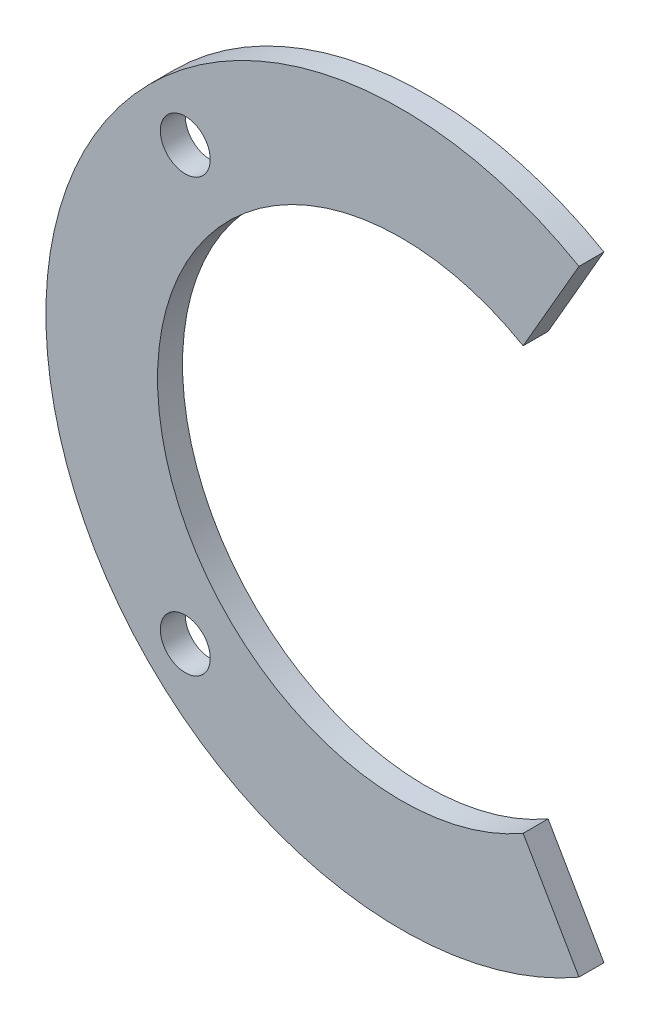
ISO-10303-21;
HEADER;
FILE_DESCRIPTION(('STEP AP214'),'2;1');
FILE_NAME('part.step','',(''),(''),'','','');
FILE_SCHEMA(('AUTOMOTIVE_DESIGN { 1 0 10303 214 1 1 1 1 }'));
ENDSEC;
DATA;
#1=APPLICATION_CONTEXT('core data for automotive mechanical design processes');
#2=APPLICATION_PROTOCOL_DEFINITION('international standard','automotive_design',2000,#1);
#3=PRODUCT_CONTEXT('',#1,'mechanical');
#4=PRODUCT('Part','Part','',(#3));
#5=PRODUCT_RELATED_PRODUCT_CATEGORY('part','',(#4));
#6=PRODUCT_DEFINITION_FORMATION('','',#4);
#7=PRODUCT_DEFINITION_CONTEXT('part definition',#1,'design');
#8=PRODUCT_DEFINITION('design','',#6,#7);
#9=PRODUCT_DEFINITION_SHAPE('','',#8);
#10=(LENGTH_UNIT() NAMED_UNIT(*) SI_UNIT(.MILLI.,.METRE.));
#11=(NAMED_UNIT(*) PLANE_ANGLE_UNIT() SI_UNIT($,.RADIAN.));
#12=(NAMED_UNIT(*) SI_UNIT($,.STERADIAN.) SOLID_ANGLE_UNIT());
#13=UNCERTAINTY_MEASURE_WITH_UNIT(LENGTH_MEASURE(1.E-05),#10,'distance_accuracy_value','');
#14=(GEOMETRIC_REPRESENTATION_CONTEXT(3) GLOBAL_UNCERTAINTY_ASSIGNED_CONTEXT((#13)) GLOBAL_UNIT_ASSIGNED_CONTEXT((#10,
#11,#12)) REPRESENTATION_CONTEXT('',''));
#15=CARTESIAN_POINT('',(0.,0.,0.));
#16=DIRECTION('',(0.,0.,1.));
#17=DIRECTION('',(1.,0.,0.));
#18=AXIS2_PLACEMENT_3D('',#15,#16,#17);
#19=CARTESIAN_POINT('',(0.,0.,3.175));
#20=DIRECTION('',(0.,0.,1.));
#21=DIRECTION('',(1.,0.,0.));
#22=AXIS2_PLACEMENT_3D('',#19,#20,#21);
#23=PLANE('',#22);
#24=CARTESIAN_POINT('',(-27.4710984490973,-27.4710984490974,3.175));
#25=DIRECTION('',(0.,0.,1.));
#26=DIRECTION('',(1.,0.,0.));
#27=AXIS2_PLACEMENT_3D('',#24,#25,#26);
#28=CIRCLE('',#27,3.175);
#29=CARTESIAN_POINT('',(-24.2960984490973,-27.4710984490974,3.175));
#30=VERTEX_POINT('',#29);
#31=EDGE_CURVE('E112',#30,#30,#28,.T.);
#32=ORIENTED_EDGE('',*,*,#31,.F.);
#33=EDGE_LOOP('',(#32));
#34=FACE_BOUND('',#33,.T.);
#35=CARTESIAN_POINT('',(0.,0.,3.175));
#36=DIRECTION('',(0.,0.,-1.));
#37=DIRECTION('',(1.,0.,0.));
#38=AXIS2_PLACEMENT_3D('',#35,#36,#37);
#39=CIRCLE('',#38,31.000000024);
#40=CARTESIAN_POINT('',(15.5000000119999,-26.8467875381022,3.175));
#41=VERTEX_POINT('',#40);
#42=CARTESIAN_POINT('',(15.5000000119999,26.8467875381022,3.175));
#43=VERTEX_POINT('',#42);
#44=EDGE_CURVE('E92',#41,#43,#39,.T.);
#45=ORIENTED_EDGE('',*,*,#44,.T.);
#46=DIRECTION('',(0.499999999999998,0.866025403784439,0.));
#47=VECTOR('',#46,1.);
#48=CARTESIAN_POINT('',(22.5999999999999,39.1443482510567,3.175));
#49=LINE('',#48,#47);
#50=CARTESIAN_POINT('',(22.5999999999999,39.1443482510567,3.175));
#51=VERTEX_POINT('',#50);
#52=EDGE_CURVE('E87',#43,#51,#49,.T.);
#53=ORIENTED_EDGE('',*,*,#52,.T.);
#54=CARTESIAN_POINT('',(0.,0.,3.175));
#55=DIRECTION('',(0.,0.,1.));
#56=DIRECTION('',(1.,0.,0.));
#57=AXIS2_PLACEMENT_3D('',#54,#55,#56);
#58=CIRCLE('',#57,45.2);
#59=CARTESIAN_POINT('',(22.5999999999999,-39.1443482510567,3.175));
#60=VERTEX_POINT('',#59);
#61=EDGE_CURVE('E90',#51,#60,#58,.T.);
#62=ORIENTED_EDGE('',*,*,#61,.T.);
#63=DIRECTION('',(-0.499999999999998,0.866025403784439,0.));
#64=VECTOR('',#63,1.);
#65=CARTESIAN_POINT('',(22.5999999999999,-39.1443482510567,3.175));
#66=LINE('',#65,#64);
#67=EDGE_CURVE('E57',#60,#41,#66,.T.);
#68=ORIENTED_EDGE('',*,*,#67,.T.);
#69=EDGE_LOOP('',(#45,#53,#62,#68));
#70=FACE_BOUND('',#69,.T.);
#71=CARTESIAN_POINT('',(-27.4710984490975,27.4710984490972,3.175));
#72=DIRECTION('',(0.,0.,1.));
#73=DIRECTION('',(1.,0.,0.));
#74=AXIS2_PLACEMENT_3D('',#71,#72,#73);
#75=CIRCLE('',#74,3.17500000000001);
#76=CARTESIAN_POINT('',(-24.2960984490975,27.4710984490972,3.175));
#77=VERTEX_POINT('',#76);
#78=EDGE_CURVE('E134',#77,#77,#75,.T.);
#79=ORIENTED_EDGE('',*,*,#78,.F.);
#80=EDGE_LOOP('',(#79));
#81=FACE_BOUND('',#80,.T.);
#82=ADVANCED_FACE('F39',(#34,#70,#81),#23,.T.);
#83=CARTESIAN_POINT('',(0.,0.,0.));
#84=DIRECTION('',(0.,0.,1.));
#85=DIRECTION('',(1.,0.,0.));
#86=AXIS2_PLACEMENT_3D('',#83,#84,#85);
#87=PLANE('',#86);
#88=CARTESIAN_POINT('',(0.,0.,0.));
#89=DIRECTION('',(0.,0.,-1.));
#90=DIRECTION('',(1.,0.,0.));
#91=AXIS2_PLACEMENT_3D('',#88,#89,#90);
#92=CIRCLE('',#91,31.000000024);
#93=CARTESIAN_POINT('',(15.5000000119999,-26.8467875381022,0.));
#94=VERTEX_POINT('',#93);
#95=CARTESIAN_POINT('',(15.5000000119999,26.8467875381022,0.));
#96=VERTEX_POINT('',#95);
#97=EDGE_CURVE('E108',#94,#96,#92,.T.);
#98=ORIENTED_EDGE('',*,*,#97,.F.);
#99=DIRECTION('',(-0.499999999999998,0.866025403784439,0.));
#100=VECTOR('',#99,1.);
#101=CARTESIAN_POINT('',(22.5999999999999,-39.1443482510567,0.));
#102=LINE('',#101,#100);
#103=CARTESIAN_POINT('',(22.5999999999999,-39.1443482510567,0.));
#104=VERTEX_POINT('',#103);
#105=EDGE_CURVE('E80',#104,#94,#102,.T.);
#106=ORIENTED_EDGE('',*,*,#105,.F.);
#107=CARTESIAN_POINT('',(0.,0.,0.));
#108=DIRECTION('',(0.,0.,1.));
#109=DIRECTION('',(1.,0.,0.));
#110=AXIS2_PLACEMENT_3D('',#107,#108,#109);
#111=CIRCLE('',#110,45.2);
#112=CARTESIAN_POINT('',(22.5999999999999,39.1443482510567,0.));
#113=VERTEX_POINT('',#112);
#114=EDGE_CURVE('E74',#113,#104,#111,.T.);
#115=ORIENTED_EDGE('',*,*,#114,.F.);
#116=DIRECTION('',(0.499999999999998,0.866025403784439,0.));
#117=VECTOR('',#116,1.);
#118=CARTESIAN_POINT('',(22.5999999999999,39.1443482510567,0.));
#119=LINE('',#118,#117);
#120=EDGE_CURVE('E97',#96,#113,#119,.T.);
#121=ORIENTED_EDGE('',*,*,#120,.F.);
#122=EDGE_LOOP('',(#98,#106,#115,#121));
#123=FACE_BOUND('',#122,.T.);
#124=CARTESIAN_POINT('',(-27.4710984490973,-27.4710984490974,0.));
#125=DIRECTION('',(0.,0.,1.));
#126=DIRECTION('',(1.,0.,0.));
#127=AXIS2_PLACEMENT_3D('',#124,#125,#126);
#128=CIRCLE('',#127,3.175);
#129=CARTESIAN_POINT('',(-24.2960984490973,-27.4710984490974,0.));
#130=VERTEX_POINT('',#129);
#131=EDGE_CURVE('E130',#130,#130,#128,.T.);
#132=ORIENTED_EDGE('',*,*,#131,.T.);
#133=EDGE_LOOP('',(#132));
#134=FACE_BOUND('',#133,.T.);
#135=CARTESIAN_POINT('',(-27.4710984490975,27.4710984490972,0.));
#136=DIRECTION('',(0.,0.,1.));
#137=DIRECTION('',(1.,0.,0.));
#138=AXIS2_PLACEMENT_3D('',#135,#136,#137);
#139=CIRCLE('',#138,3.17500000000001);
#140=CARTESIAN_POINT('',(-24.2960984490975,27.4710984490972,0.));
#141=VERTEX_POINT('',#140);
#142=EDGE_CURVE('E138',#141,#141,#139,.T.);
#143=ORIENTED_EDGE('',*,*,#142,.T.);
#144=EDGE_LOOP('',(#143));
#145=FACE_BOUND('',#144,.T.);
#146=ADVANCED_FACE('F125',(#123,#134,#145),#87,.F.);
#147=CARTESIAN_POINT('',(0.,0.,3.175));
#148=DIRECTION('',(0.,0.,-1.));
#149=DIRECTION('',(-1.,0.,0.));
#150=AXIS2_PLACEMENT_3D('',#147,#148,#149);
#151=CYLINDRICAL_SURFACE('',#150,31.000000024);
#152=ORIENTED_EDGE('',*,*,#97,.T.);
#153=DIRECTION('',(0.,0.,-1.));
#154=VECTOR('',#153,1.);
#155=CARTESIAN_POINT('',(15.5000000119999,26.8467875381022,3.175));
#156=LINE('',#155,#154);
#157=EDGE_CURVE('E11',#43,#96,#156,.T.);
#158=ORIENTED_EDGE('',*,*,#157,.F.);
#159=ORIENTED_EDGE('',*,*,#44,.F.);
#160=DIRECTION('',(0.,0.,-1.));
#161=VECTOR('',#160,1.);
#162=CARTESIAN_POINT('',(15.5000000119999,-26.8467875381022,3.175));
#163=LINE('',#162,#161);
#164=EDGE_CURVE('E104',#41,#94,#163,.T.);
#165=ORIENTED_EDGE('',*,*,#164,.T.);
#166=EDGE_LOOP('',(#152,#158,#159,#165));
#167=FACE_BOUND('',#166,.T.);
#168=ADVANCED_FACE('F41',(#167),#151,.F.);
#169=CARTESIAN_POINT('',(22.5999999999999,39.1443482510567,3.175));
#170=DIRECTION('',(-0.866025403784439,0.499999999999998,0.));
#171=DIRECTION('',(-0.499999999999998,-0.86602540378444,0.));
#172=AXIS2_PLACEMENT_3D('',#169,#170,#171);
#173=PLANE('',#172);
#174=ORIENTED_EDGE('',*,*,#120,.T.);
#175=DIRECTION('',(0.,0.,-1.));
#176=VECTOR('',#175,1.);
#177=CARTESIAN_POINT('',(22.5999999999999,39.1443482510567,3.175));
#178=LINE('',#177,#176);
#179=EDGE_CURVE('E49',#51,#113,#178,.T.);
#180=ORIENTED_EDGE('',*,*,#179,.F.);
#181=ORIENTED_EDGE('',*,*,#52,.F.);
#182=ORIENTED_EDGE('',*,*,#157,.T.);
#183=EDGE_LOOP('',(#174,#180,#181,#182));
#184=FACE_BOUND('',#183,.T.);
#185=ADVANCED_FACE('F96',(#184),#173,.F.);
#186=CARTESIAN_POINT('',(0.,0.,3.175));
#187=DIRECTION('',(0.,0.,-1.));
#188=DIRECTION('',(-1.,0.,0.));
#189=AXIS2_PLACEMENT_3D('',#186,#187,#188);
#190=CYLINDRICAL_SURFACE('',#189,45.2);
#191=ORIENTED_EDGE('',*,*,#114,.T.);
#192=DIRECTION('',(0.,0.,-1.));
#193=VECTOR('',#192,1.);
#194=CARTESIAN_POINT('',(22.5999999999999,-39.1443482510567,3.175));
#195=LINE('',#194,#193);
#196=EDGE_CURVE('E99',#60,#104,#195,.T.);
#197=ORIENTED_EDGE('',*,*,#196,.F.);
#198=ORIENTED_EDGE('',*,*,#61,.F.);
#199=ORIENTED_EDGE('',*,*,#179,.T.);
#200=EDGE_LOOP('',(#191,#197,#198,#199));
#201=FACE_BOUND('',#200,.T.);
#202=ADVANCED_FACE('F100',(#201),#190,.T.);
#203=CARTESIAN_POINT('',(22.5999999999999,-39.1443482510567,3.175));
#204=DIRECTION('',(-0.866025403784439,-0.499999999999998,0.));
#205=DIRECTION('',(0.499999999999998,-0.86602540378444,0.));
#206=AXIS2_PLACEMENT_3D('',#203,#204,#205);
#207=PLANE('',#206);
#208=ORIENTED_EDGE('',*,*,#105,.T.);
#209=ORIENTED_EDGE('',*,*,#164,.F.);
#210=ORIENTED_EDGE('',*,*,#67,.F.);
#211=ORIENTED_EDGE('',*,*,#196,.T.);
#212=EDGE_LOOP('',(#208,#209,#210,#211));
#213=FACE_BOUND('',#212,.T.);
#214=ADVANCED_FACE('F122',(#213),#207,.F.);
#215=CARTESIAN_POINT('',(-27.4710984490973,-27.4710984490974,3.175));
#216=DIRECTION('',(0.,0.,-1.));
#217=DIRECTION('',(-1.,0.,0.));
#218=AXIS2_PLACEMENT_3D('',#215,#216,#217);
#219=CYLINDRICAL_SURFACE('',#218,3.175);
#220=ORIENTED_EDGE('',*,*,#31,.T.);
#221=EDGE_LOOP('',(#220));
#222=FACE_BOUND('',#221,.T.);
#223=ORIENTED_EDGE('',*,*,#131,.F.);
#224=EDGE_LOOP('',(#223));
#225=FACE_BOUND('',#224,.T.);
#226=ADVANCED_FACE('F157',(#222,#225),#219,.F.);
#227=CARTESIAN_POINT('',(-27.4710984490975,27.4710984490972,3.175));
#228=DIRECTION('',(0.,0.,-1.));
#229=DIRECTION('',(-1.,0.,0.));
#230=AXIS2_PLACEMENT_3D('',#227,#228,#229);
#231=CYLINDRICAL_SURFACE('',#230,3.17500000000001);
#232=ORIENTED_EDGE('',*,*,#78,.T.);
#233=EDGE_LOOP('',(#232));
#234=FACE_BOUND('',#233,.T.);
#235=ORIENTED_EDGE('',*,*,#142,.F.);
#236=EDGE_LOOP('',(#235));
#237=FACE_BOUND('',#236,.T.);
#238=ADVANCED_FACE('F146',(#234,#237),#231,.F.);
#239=CLOSED_SHELL('',(#82,#146,#168,#185,#202,#214,#226,#238));
#240=MANIFOLD_SOLID_BREP('B2',#239);
#241=ADVANCED_BREP_SHAPE_REPRESENTATION('',(#18,#240),#14);
#242=SHAPE_DEFINITION_REPRESENTATION(#9,#241);
ENDSEC;
END-ISO-10303-21;
